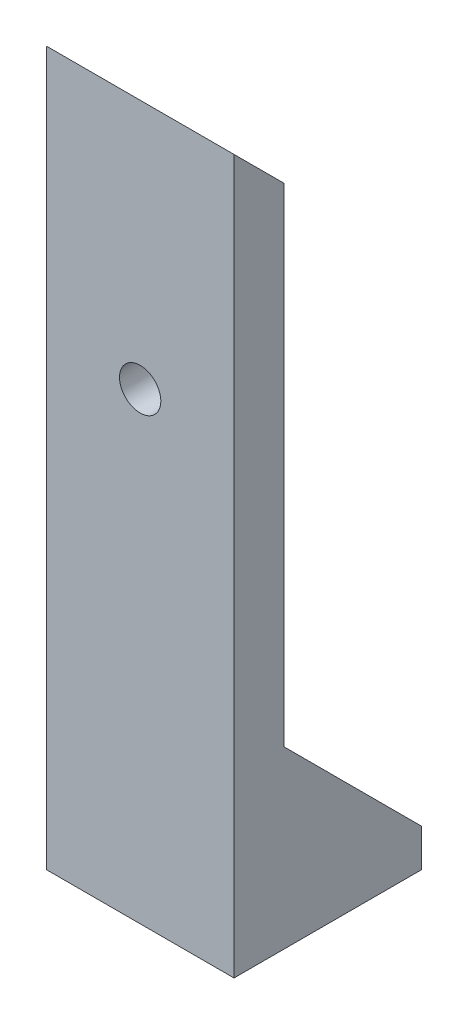
ISO-10303-21;
HEADER;
FILE_DESCRIPTION(('STEP AP214'),'2;1');
FILE_NAME('part.step','',(''),(''),'','','');
FILE_SCHEMA(('AUTOMOTIVE_DESIGN { 1 0 10303 214 1 1 1 1 }'));
ENDSEC;
DATA;
#1=APPLICATION_CONTEXT('core data for automotive mechanical design processes');
#2=APPLICATION_PROTOCOL_DEFINITION('international standard','automotive_design',2000,#1);
#3=PRODUCT_CONTEXT('',#1,'mechanical');
#4=PRODUCT('Part','Part','',(#3));
#5=PRODUCT_RELATED_PRODUCT_CATEGORY('part','',(#4));
#6=PRODUCT_DEFINITION_FORMATION('','',#4);
#7=PRODUCT_DEFINITION_CONTEXT('part definition',#1,'design');
#8=PRODUCT_DEFINITION('design','',#6,#7);
#9=PRODUCT_DEFINITION_SHAPE('','',#8);
#10=(LENGTH_UNIT() NAMED_UNIT(*) SI_UNIT(.MILLI.,.METRE.));
#11=(NAMED_UNIT(*) PLANE_ANGLE_UNIT() SI_UNIT($,.RADIAN.));
#12=(NAMED_UNIT(*) SI_UNIT($,.STERADIAN.) SOLID_ANGLE_UNIT());
#13=UNCERTAINTY_MEASURE_WITH_UNIT(LENGTH_MEASURE(1.E-05),#10,'distance_accuracy_value','');
#14=(GEOMETRIC_REPRESENTATION_CONTEXT(3) GLOBAL_UNCERTAINTY_ASSIGNED_CONTEXT((#13)) GLOBAL_UNIT_ASSIGNED_CONTEXT((#10,
#11,#12)) REPRESENTATION_CONTEXT('',''));
#15=CARTESIAN_POINT('',(0.,0.,0.));
#16=DIRECTION('',(0.,0.,1.));
#17=DIRECTION('',(1.,0.,0.));
#18=AXIS2_PLACEMENT_3D('',#15,#16,#17);
#19=CARTESIAN_POINT('',(0.,3.,0.));
#20=DIRECTION('',(0.,-1.,0.));
#21=DIRECTION('',(0.,0.,-1.));
#22=AXIS2_PLACEMENT_3D('',#19,#20,#21);
#23=PLANE('',#22);
#24=CARTESIAN_POINT('',(7.5,3.,-9.));
#25=DIRECTION('',(0.,1.,0.));
#26=DIRECTION('',(0.,0.,1.));
#27=AXIS2_PLACEMENT_3D('',#24,#25,#26);
#28=CIRCLE('',#27,2.65);
#29=CARTESIAN_POINT('',(7.5,3.,-6.35));
#30=VERTEX_POINT('',#29);
#31=EDGE_CURVE('E152',#30,#30,#28,.T.);
#32=ORIENTED_EDGE('',*,*,#31,.F.);
#33=EDGE_LOOP('',(#32));
#34=FACE_BOUND('',#33,.T.);
#35=DIRECTION('',(0.,0.,-1.));
#36=VECTOR('',#35,1.);
#37=CARTESIAN_POINT('',(3.,3.,-15.));
#38=LINE('',#37,#36);
#39=CARTESIAN_POINT('',(3.,3.,-4.));
#40=VERTEX_POINT('',#39);
#41=CARTESIAN_POINT('',(3.,3.,-15.));
#42=VERTEX_POINT('',#41);
#43=EDGE_CURVE('E177',#40,#42,#38,.T.);
#44=ORIENTED_EDGE('',*,*,#43,.F.);
#45=DIRECTION('',(-1.,0.,0.));
#46=VECTOR('',#45,1.);
#47=CARTESIAN_POINT('',(0.,3.,-4.));
#48=LINE('',#47,#46);
#49=CARTESIAN_POINT('',(12.,3.,-4.));
#50=VERTEX_POINT('',#49);
#51=EDGE_CURVE('E121',#50,#40,#48,.T.);
#52=ORIENTED_EDGE('',*,*,#51,.F.);
#53=DIRECTION('',(0.,0.,-1.));
#54=VECTOR('',#53,1.);
#55=CARTESIAN_POINT('',(12.,3.,-15.));
#56=LINE('',#55,#54);
#57=CARTESIAN_POINT('',(12.,3.,-15.));
#58=VERTEX_POINT('',#57);
#59=EDGE_CURVE('E53',#50,#58,#56,.T.);
#60=ORIENTED_EDGE('',*,*,#59,.T.);
#61=DIRECTION('',(-1.,0.,0.));
#62=VECTOR('',#61,1.);
#63=CARTESIAN_POINT('',(0.,3.,-15.));
#64=LINE('',#63,#62);
#65=EDGE_CURVE('E145',#58,#42,#64,.T.);
#66=ORIENTED_EDGE('',*,*,#65,.T.);
#67=EDGE_LOOP('',(#44,#52,#60,#66));
#68=FACE_BOUND('',#67,.T.);
#69=ADVANCED_FACE('F37',(#34,#68),#23,.F.);
#70=CARTESIAN_POINT('',(0.,57.,-4.));
#71=DIRECTION('',(0.,0.,1.));
#72=DIRECTION('',(1.,0.,0.));
#73=AXIS2_PLACEMENT_3D('',#70,#71,#72);
#74=PLANE('',#73);
#75=CARTESIAN_POINT('',(7.5,37.,-4.));
#76=DIRECTION('',(0.,0.,-1.));
#77=DIRECTION('',(-1.,0.,0.));
#78=AXIS2_PLACEMENT_3D('',#75,#76,#77);
#79=CIRCLE('',#78,1.65);
#80=CARTESIAN_POINT('',(5.85,37.,-4.));
#81=VERTEX_POINT('',#80);
#82=EDGE_CURVE('E187',#81,#81,#79,.T.);
#83=ORIENTED_EDGE('',*,*,#82,.F.);
#84=EDGE_LOOP('',(#83));
#85=FACE_BOUND('',#84,.T.);
#86=DIRECTION('',(0.,-1.,0.));
#87=VECTOR('',#86,1.);
#88=CARTESIAN_POINT('',(0.,57.,-4.));
#89=LINE('',#88,#87);
#90=CARTESIAN_POINT('',(0.,53.,-4.));
#91=VERTEX_POINT('',#90);
#92=CARTESIAN_POINT('',(0.,13.9999999999999,-4.));
#93=VERTEX_POINT('',#92);
#94=EDGE_CURVE('E120',#91,#93,#89,.T.);
#95=ORIENTED_EDGE('',*,*,#94,.F.);
#96=DIRECTION('',(1.,0.,0.));
#97=VECTOR('',#96,1.);
#98=CARTESIAN_POINT('',(-5.,53.,-4.));
#99=LINE('',#98,#97);
#100=CARTESIAN_POINT('',(15.,53.,-4.));
#101=VERTEX_POINT('',#100);
#102=EDGE_CURVE('E130',#91,#101,#99,.T.);
#103=ORIENTED_EDGE('',*,*,#102,.T.);
#104=DIRECTION('',(0.,-1.,0.));
#105=VECTOR('',#104,1.);
#106=CARTESIAN_POINT('',(15.,57.,-4.));
#107=LINE('',#106,#105);
#108=CARTESIAN_POINT('',(15.,13.9999999999999,-4.));
#109=VERTEX_POINT('',#108);
#110=EDGE_CURVE('E129',#101,#109,#107,.T.);
#111=ORIENTED_EDGE('',*,*,#110,.T.);
#112=DIRECTION('',(1.,0.,0.));
#113=VECTOR('',#112,1.);
#114=CARTESIAN_POINT('',(12.,13.9999999999999,-4.));
#115=LINE('',#114,#113);
#116=CARTESIAN_POINT('',(12.,13.9999999999999,-4.));
#117=VERTEX_POINT('',#116);
#118=EDGE_CURVE('E61',#117,#109,#115,.T.);
#119=ORIENTED_EDGE('',*,*,#118,.F.);
#120=DIRECTION('',(0.,-1.,0.));
#121=VECTOR('',#120,1.);
#122=CARTESIAN_POINT('',(12.,3.,-4.));
#123=LINE('',#122,#121);
#124=EDGE_CURVE('E168',#117,#50,#123,.T.);
#125=ORIENTED_EDGE('',*,*,#124,.T.);
#126=ORIENTED_EDGE('',*,*,#51,.T.);
#127=DIRECTION('',(0.,-1.,0.));
#128=VECTOR('',#127,1.);
#129=CARTESIAN_POINT('',(3.,3.,-4.));
#130=LINE('',#129,#128);
#131=CARTESIAN_POINT('',(3.,13.9999999999999,-4.));
#132=VERTEX_POINT('',#131);
#133=EDGE_CURVE('E182',#132,#40,#130,.T.);
#134=ORIENTED_EDGE('',*,*,#133,.F.);
#135=DIRECTION('',(-1.,0.,0.));
#136=VECTOR('',#135,1.);
#137=CARTESIAN_POINT('',(3.,13.9999999999999,-4.));
#138=LINE('',#137,#136);
#139=EDGE_CURVE('E174',#132,#93,#138,.T.);
#140=ORIENTED_EDGE('',*,*,#139,.T.);
#141=EDGE_LOOP('',(#95,#103,#111,#119,#125,#126,#134,#140));
#142=FACE_BOUND('',#141,.T.);
#143=ADVANCED_FACE('F192',(#85,#142),#74,.F.);
#144=CARTESIAN_POINT('',(0.,0.,0.));
#145=DIRECTION('',(0.,-1.,0.));
#146=DIRECTION('',(0.,0.,-1.));
#147=AXIS2_PLACEMENT_3D('',#144,#145,#146);
#148=PLANE('',#147);
#149=DIRECTION('',(0.,0.,1.));
#150=VECTOR('',#149,1.);
#151=CARTESIAN_POINT('',(0.,0.,0.));
#152=LINE('',#151,#150);
#153=CARTESIAN_POINT('',(0.,0.,-15.));
#154=VERTEX_POINT('',#153);
#155=CARTESIAN_POINT('',(0.,0.,0.));
#156=VERTEX_POINT('',#155);
#157=EDGE_CURVE('E149',#154,#156,#152,.T.);
#158=ORIENTED_EDGE('',*,*,#157,.F.);
#159=DIRECTION('',(-1.,0.,0.));
#160=VECTOR('',#159,1.);
#161=CARTESIAN_POINT('',(0.,0.,-15.));
#162=LINE('',#161,#160);
#163=CARTESIAN_POINT('',(15.,0.,-15.));
#164=VERTEX_POINT('',#163);
#165=EDGE_CURVE('E143',#164,#154,#162,.T.);
#166=ORIENTED_EDGE('',*,*,#165,.F.);
#167=DIRECTION('',(0.,0.,-1.));
#168=VECTOR('',#167,1.);
#169=CARTESIAN_POINT('',(15.,0.,0.));
#170=LINE('',#169,#168);
#171=CARTESIAN_POINT('',(15.,0.,0.));
#172=VERTEX_POINT('',#171);
#173=EDGE_CURVE('E146',#172,#164,#170,.T.);
#174=ORIENTED_EDGE('',*,*,#173,.F.);
#175=DIRECTION('',(1.,0.,0.));
#176=VECTOR('',#175,1.);
#177=CARTESIAN_POINT('',(0.,0.,0.));
#178=LINE('',#177,#176);
#179=EDGE_CURVE('E133',#156,#172,#178,.T.);
#180=ORIENTED_EDGE('',*,*,#179,.F.);
#181=EDGE_LOOP('',(#158,#166,#174,#180));
#182=FACE_BOUND('',#181,.T.);
#183=CARTESIAN_POINT('',(7.5,0.,-9.));
#184=DIRECTION('',(0.,1.,0.));
#185=DIRECTION('',(0.,0.,1.));
#186=AXIS2_PLACEMENT_3D('',#183,#184,#185);
#187=CIRCLE('',#186,2.65);
#188=CARTESIAN_POINT('',(7.5,0.,-6.35));
#189=VERTEX_POINT('',#188);
#190=EDGE_CURVE('E155',#189,#189,#187,.T.);
#191=ORIENTED_EDGE('',*,*,#190,.T.);
#192=EDGE_LOOP('',(#191));
#193=FACE_BOUND('',#192,.T.);
#194=ADVANCED_FACE('F199',(#182,#193),#148,.T.);
#195=CARTESIAN_POINT('',(0.,3.,0.));
#196=DIRECTION('',(1.,0.,0.));
#197=DIRECTION('',(0.,0.,-1.));
#198=AXIS2_PLACEMENT_3D('',#195,#196,#197);
#199=PLANE('',#198);
#200=DIRECTION('',(0.,-1.,0.));
#201=VECTOR('',#200,1.);
#202=CARTESIAN_POINT('',(0.,3.,0.));
#203=LINE('',#202,#201);
#204=CARTESIAN_POINT('',(0.,57.,0.));
#205=VERTEX_POINT('',#204);
#206=EDGE_CURVE('E11',#205,#156,#203,.T.);
#207=ORIENTED_EDGE('',*,*,#206,.F.);
#208=DIRECTION('',(0.,-0.707106781186546,-0.707106781186549));
#209=VECTOR('',#208,1.);
#210=CARTESIAN_POINT('',(0.,30.0000000000001,-27.));
#211=LINE('',#210,#209);
#212=EDGE_CURVE('E116',#205,#91,#211,.T.);
#213=ORIENTED_EDGE('',*,*,#212,.T.);
#214=ORIENTED_EDGE('',*,*,#94,.T.);
#215=DIRECTION('',(0.,0.707106781186543,0.707106781186551));
#216=VECTOR('',#215,1.);
#217=CARTESIAN_POINT('',(0.,13.9999999999999,-4.));
#218=LINE('',#217,#216);
#219=CARTESIAN_POINT('',(0.,3.,-15.));
#220=VERTEX_POINT('',#219);
#221=EDGE_CURVE('E179',#220,#93,#218,.T.);
#222=ORIENTED_EDGE('',*,*,#221,.F.);
#223=DIRECTION('',(0.,-1.,0.));
#224=VECTOR('',#223,1.);
#225=CARTESIAN_POINT('',(0.,3.,-15.));
#226=LINE('',#225,#224);
#227=EDGE_CURVE('E137',#220,#154,#226,.T.);
#228=ORIENTED_EDGE('',*,*,#227,.T.);
#229=ORIENTED_EDGE('',*,*,#157,.T.);
#230=EDGE_LOOP('',(#207,#213,#214,#222,#228,#229));
#231=FACE_BOUND('',#230,.T.);
#232=ADVANCED_FACE('F39',(#231),#199,.F.);
#233=CARTESIAN_POINT('',(0.,3.,0.));
#234=DIRECTION('',(0.,0.,-1.));
#235=DIRECTION('',(-1.,0.,0.));
#236=AXIS2_PLACEMENT_3D('',#233,#234,#235);
#237=PLANE('',#236);
#238=CARTESIAN_POINT('',(7.5,37.,0.));
#239=DIRECTION('',(0.,0.,-1.));
#240=DIRECTION('',(-1.,0.,0.));
#241=AXIS2_PLACEMENT_3D('',#238,#239,#240);
#242=CIRCLE('',#241,1.65);
#243=CARTESIAN_POINT('',(5.85,37.,0.));
#244=VERTEX_POINT('',#243);
#245=EDGE_CURVE('E41',#244,#244,#242,.T.);
#246=ORIENTED_EDGE('',*,*,#245,.T.);
#247=EDGE_LOOP('',(#246));
#248=FACE_BOUND('',#247,.T.);
#249=ORIENTED_EDGE('',*,*,#179,.T.);
#250=DIRECTION('',(0.,-1.,0.));
#251=VECTOR('',#250,1.);
#252=CARTESIAN_POINT('',(15.,3.,0.));
#253=LINE('',#252,#251);
#254=CARTESIAN_POINT('',(15.,57.,0.));
#255=VERTEX_POINT('',#254);
#256=EDGE_CURVE('E46',#255,#172,#253,.T.);
#257=ORIENTED_EDGE('',*,*,#256,.F.);
#258=DIRECTION('',(1.,0.,0.));
#259=VECTOR('',#258,1.);
#260=CARTESIAN_POINT('',(0.,57.,0.));
#261=LINE('',#260,#259);
#262=EDGE_CURVE('E110',#205,#255,#261,.T.);
#263=ORIENTED_EDGE('',*,*,#262,.F.);
#264=ORIENTED_EDGE('',*,*,#206,.T.);
#265=EDGE_LOOP('',(#249,#257,#263,#264));
#266=FACE_BOUND('',#265,.T.);
#267=ADVANCED_FACE('F132',(#248,#266),#237,.F.);
#268=CARTESIAN_POINT('',(15.,3.,0.));
#269=DIRECTION('',(-1.,0.,0.));
#270=DIRECTION('',(0.,0.,1.));
#271=AXIS2_PLACEMENT_3D('',#268,#269,#270);
#272=PLANE('',#271);
#273=ORIENTED_EDGE('',*,*,#110,.F.);
#274=DIRECTION('',(0.,-0.707106781186546,-0.707106781186549));
#275=VECTOR('',#274,1.);
#276=CARTESIAN_POINT('',(15.,57.,0.));
#277=LINE('',#276,#275);
#278=EDGE_CURVE('E113',#255,#101,#277,.T.);
#279=ORIENTED_EDGE('',*,*,#278,.F.);
#280=ORIENTED_EDGE('',*,*,#256,.T.);
#281=ORIENTED_EDGE('',*,*,#173,.T.);
#282=DIRECTION('',(0.,-1.,0.));
#283=VECTOR('',#282,1.);
#284=CARTESIAN_POINT('',(15.,3.,-15.));
#285=LINE('',#284,#283);
#286=CARTESIAN_POINT('',(15.,3.,-15.));
#287=VERTEX_POINT('',#286);
#288=EDGE_CURVE('E134',#287,#164,#285,.T.);
#289=ORIENTED_EDGE('',*,*,#288,.F.);
#290=DIRECTION('',(0.,0.707106781186543,0.707106781186551));
#291=VECTOR('',#290,1.);
#292=CARTESIAN_POINT('',(15.,13.9999999999999,-4.));
#293=LINE('',#292,#291);
#294=EDGE_CURVE('E166',#287,#109,#293,.T.);
#295=ORIENTED_EDGE('',*,*,#294,.T.);
#296=EDGE_LOOP('',(#273,#279,#280,#281,#289,#295));
#297=FACE_BOUND('',#296,.T.);
#298=ADVANCED_FACE('F126',(#297),#272,.F.);
#299=CARTESIAN_POINT('',(0.,3.,-15.));
#300=DIRECTION('',(0.,0.,1.));
#301=DIRECTION('',(1.,0.,0.));
#302=AXIS2_PLACEMENT_3D('',#299,#300,#301);
#303=PLANE('',#302);
#304=ORIENTED_EDGE('',*,*,#165,.T.);
#305=ORIENTED_EDGE('',*,*,#227,.F.);
#306=DIRECTION('',(-1.,0.,0.));
#307=VECTOR('',#306,1.);
#308=CARTESIAN_POINT('',(3.,3.,-15.));
#309=LINE('',#308,#307);
#310=EDGE_CURVE('E169',#42,#220,#309,.T.);
#311=ORIENTED_EDGE('',*,*,#310,.F.);
#312=ORIENTED_EDGE('',*,*,#65,.F.);
#313=EDGE_CURVE('E142',#287,#58,#64,.T.);
#314=ORIENTED_EDGE('',*,*,#313,.F.);
#315=ORIENTED_EDGE('',*,*,#288,.T.);
#316=EDGE_LOOP('',(#304,#305,#311,#312,#314,#315));
#317=FACE_BOUND('',#316,.T.);
#318=ADVANCED_FACE('F203',(#317),#303,.F.);
#319=CARTESIAN_POINT('',(7.5,3.,-9.));
#320=DIRECTION('',(0.,-1.,0.));
#321=DIRECTION('',(0.,0.,-1.));
#322=AXIS2_PLACEMENT_3D('',#319,#320,#321);
#323=CYLINDRICAL_SURFACE('',#322,2.65);
#324=ORIENTED_EDGE('',*,*,#31,.T.);
#325=EDGE_LOOP('',(#324));
#326=FACE_BOUND('',#325,.T.);
#327=ORIENTED_EDGE('',*,*,#190,.F.);
#328=EDGE_LOOP('',(#327));
#329=FACE_BOUND('',#328,.T.);
#330=ADVANCED_FACE('F239',(#326,#329),#323,.F.);
#331=CARTESIAN_POINT('',(12.,13.9999999999999,-4.));
#332=DIRECTION('',(0.,0.707106781186552,-0.707106781186543));
#333=DIRECTION('',(0.,0.707106781186543,0.707106781186552));
#334=AXIS2_PLACEMENT_3D('',#331,#332,#333);
#335=PLANE('',#334);
#336=ORIENTED_EDGE('',*,*,#294,.F.);
#337=ORIENTED_EDGE('',*,*,#313,.T.);
#338=DIRECTION('',(0.,0.707106781186543,0.707106781186551));
#339=VECTOR('',#338,1.);
#340=CARTESIAN_POINT('',(12.,13.9999999999999,-4.));
#341=LINE('',#340,#339);
#342=EDGE_CURVE('E165',#58,#117,#341,.T.);
#343=ORIENTED_EDGE('',*,*,#342,.T.);
#344=ORIENTED_EDGE('',*,*,#118,.T.);
#345=EDGE_LOOP('',(#336,#337,#343,#344));
#346=FACE_BOUND('',#345,.T.);
#347=ADVANCED_FACE('F208',(#346),#335,.T.);
#348=CARTESIAN_POINT('',(12.,0.,0.));
#349=DIRECTION('',(1.,0.,0.));
#350=DIRECTION('',(0.,0.,-1.));
#351=AXIS2_PLACEMENT_3D('',#348,#349,#350);
#352=PLANE('',#351);
#353=ORIENTED_EDGE('',*,*,#124,.F.);
#354=ORIENTED_EDGE('',*,*,#342,.F.);
#355=ORIENTED_EDGE('',*,*,#59,.F.);
#356=EDGE_LOOP('',(#353,#354,#355));
#357=FACE_BOUND('',#356,.T.);
#358=ADVANCED_FACE('F210',(#357),#352,.F.);
#359=CARTESIAN_POINT('',(3.,13.9999999999999,-4.));
#360=DIRECTION('',(0.,-0.707106781186552,0.707106781186543));
#361=DIRECTION('',(0.,-0.707106781186543,-0.707106781186552));
#362=AXIS2_PLACEMENT_3D('',#359,#360,#361);
#363=PLANE('',#362);
#364=ORIENTED_EDGE('',*,*,#221,.T.);
#365=ORIENTED_EDGE('',*,*,#139,.F.);
#366=DIRECTION('',(0.,0.707106781186543,0.707106781186551));
#367=VECTOR('',#366,1.);
#368=CARTESIAN_POINT('',(3.,13.9999999999999,-4.));
#369=LINE('',#368,#367);
#370=EDGE_CURVE('E184',#42,#132,#369,.T.);
#371=ORIENTED_EDGE('',*,*,#370,.F.);
#372=ORIENTED_EDGE('',*,*,#310,.T.);
#373=EDGE_LOOP('',(#364,#365,#371,#372));
#374=FACE_BOUND('',#373,.T.);
#375=ADVANCED_FACE('F218',(#374),#363,.F.);
#376=CARTESIAN_POINT('',(3.,0.,0.));
#377=DIRECTION('',(-1.,0.,0.));
#378=DIRECTION('',(0.,0.,-1.));
#379=AXIS2_PLACEMENT_3D('',#376,#377,#378);
#380=PLANE('',#379);
#381=ORIENTED_EDGE('',*,*,#133,.T.);
#382=ORIENTED_EDGE('',*,*,#43,.T.);
#383=ORIENTED_EDGE('',*,*,#370,.T.);
#384=EDGE_LOOP('',(#381,#382,#383));
#385=FACE_BOUND('',#384,.T.);
#386=ADVANCED_FACE('F215',(#385),#380,.F.);
#387=CARTESIAN_POINT('',(7.5,37.,9.));
#388=DIRECTION('',(0.,0.,-1.));
#389=DIRECTION('',(-1.,0.,0.));
#390=AXIS2_PLACEMENT_3D('',#387,#388,#389);
#391=CYLINDRICAL_SURFACE('',#390,1.65);
#392=ORIENTED_EDGE('',*,*,#82,.T.);
#393=EDGE_LOOP('',(#392));
#394=FACE_BOUND('',#393,.T.);
#395=ORIENTED_EDGE('',*,*,#245,.F.);
#396=EDGE_LOOP('',(#395));
#397=FACE_BOUND('',#396,.T.);
#398=ADVANCED_FACE('F225',(#394,#397),#391,.F.);
#399=CARTESIAN_POINT('',(-5.,57.,0.));
#400=DIRECTION('',(0.,-0.707106781186549,0.707106781186546));
#401=DIRECTION('',(0.,-0.707106781186546,-0.707106781186549));
#402=AXIS2_PLACEMENT_3D('',#399,#400,#401);
#403=PLANE('',#402);
#404=ORIENTED_EDGE('',*,*,#262,.T.);
#405=ORIENTED_EDGE('',*,*,#278,.T.);
#406=ORIENTED_EDGE('',*,*,#102,.F.);
#407=ORIENTED_EDGE('',*,*,#212,.F.);
#408=EDGE_LOOP('',(#404,#405,#406,#407));
#409=FACE_BOUND('',#408,.T.);
#410=ADVANCED_FACE('F112',(#409),#403,.F.);
#411=CLOSED_SHELL('',(#69,#143,#194,#232,#267,#298,#318,#330,#347,#358,#375,#386,#398,#410));
#412=MANIFOLD_SOLID_BREP('B2',#411);
#413=ADVANCED_BREP_SHAPE_REPRESENTATION('',(#18,#412),#14);
#414=SHAPE_DEFINITION_REPRESENTATION(#9,#413);
ENDSEC;
END-ISO-10303-21;
